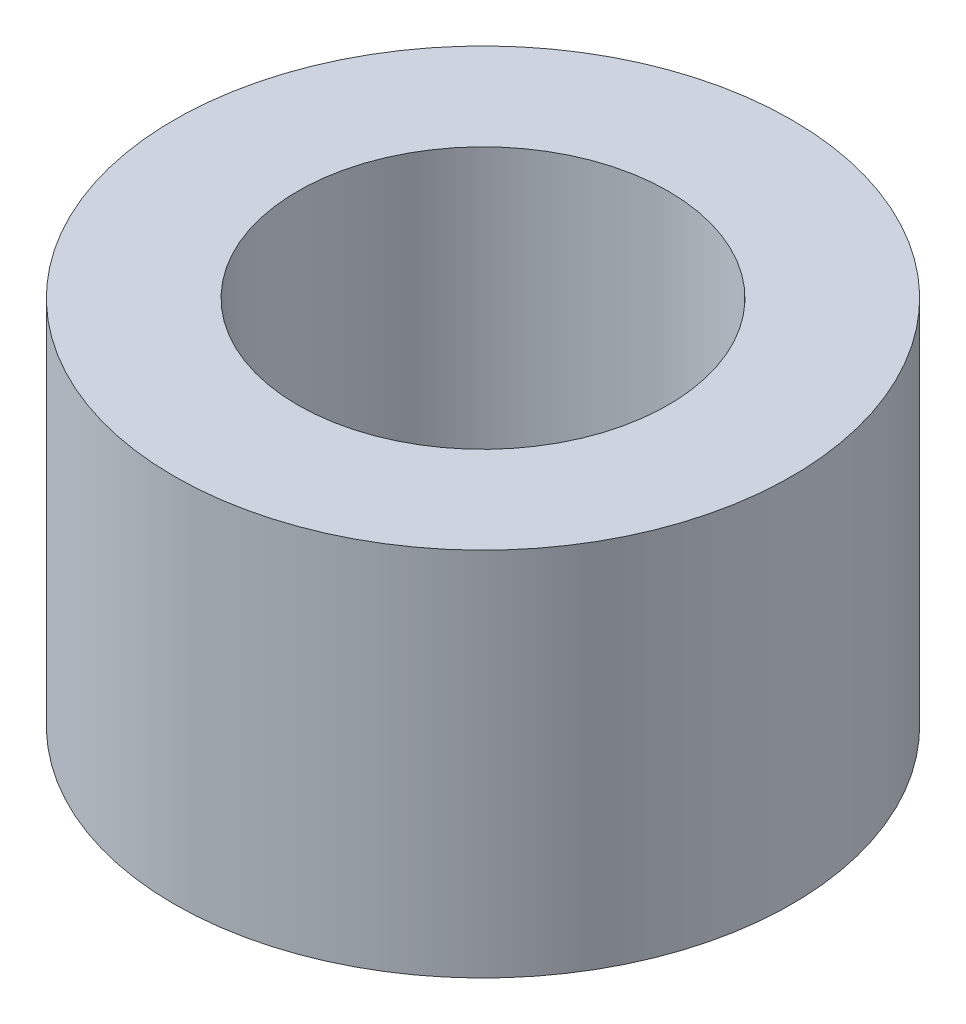
ISO-10303-21;
HEADER;
FILE_DESCRIPTION(('STEP AP214'),'2;1');
FILE_NAME('part.step','',(''),(''),'','','');
FILE_SCHEMA(('AUTOMOTIVE_DESIGN { 1 0 10303 214 1 1 1 1 }'));
ENDSEC;
DATA;
#1=APPLICATION_CONTEXT('core data for automotive mechanical design processes');
#2=APPLICATION_PROTOCOL_DEFINITION('international standard','automotive_design',2000,#1);
#3=PRODUCT_CONTEXT('',#1,'mechanical');
#4=PRODUCT('Part','Part','',(#3));
#5=PRODUCT_RELATED_PRODUCT_CATEGORY('part','',(#4));
#6=PRODUCT_DEFINITION_FORMATION('','',#4);
#7=PRODUCT_DEFINITION_CONTEXT('part definition',#1,'design');
#8=PRODUCT_DEFINITION('design','',#6,#7);
#9=PRODUCT_DEFINITION_SHAPE('','',#8);
#10=(LENGTH_UNIT() NAMED_UNIT(*) SI_UNIT(.MILLI.,.METRE.));
#11=(NAMED_UNIT(*) PLANE_ANGLE_UNIT() SI_UNIT($,.RADIAN.));
#12=(NAMED_UNIT(*) SI_UNIT($,.STERADIAN.) SOLID_ANGLE_UNIT());
#13=UNCERTAINTY_MEASURE_WITH_UNIT(LENGTH_MEASURE(1.E-05),#10,'distance_accuracy_value','');
#14=(GEOMETRIC_REPRESENTATION_CONTEXT(3) GLOBAL_UNCERTAINTY_ASSIGNED_CONTEXT((#13)) GLOBAL_UNIT_ASSIGNED_CONTEXT((#10,
#11,#12)) REPRESENTATION_CONTEXT('',''));
#15=CARTESIAN_POINT('',(0.,0.,0.));
#16=DIRECTION('',(0.,0.,1.));
#17=DIRECTION('',(1.,0.,0.));
#18=AXIS2_PLACEMENT_3D('',#15,#16,#17);
#19=CARTESIAN_POINT('',(0.,3.,0.));
#20=DIRECTION('',(0.,1.,0.));
#21=DIRECTION('',(0.,0.,1.));
#22=AXIS2_PLACEMENT_3D('',#19,#20,#21);
#23=PLANE('',#22);
#24=CARTESIAN_POINT('',(0.,3.,0.));
#25=DIRECTION('',(0.,1.,0.));
#26=DIRECTION('',(0.,0.,1.));
#27=AXIS2_PLACEMENT_3D('',#24,#25,#26);
#28=CIRCLE('',#27,2.5);
#29=CARTESIAN_POINT('',(0.,3.,2.5));
#30=VERTEX_POINT('',#29);
#31=EDGE_CURVE('E10',#30,#30,#28,.T.);
#32=ORIENTED_EDGE('',*,*,#31,.T.);
#33=EDGE_LOOP('',(#32));
#34=FACE_BOUND('',#33,.T.);
#35=CARTESIAN_POINT('',(0.,3.,0.));
#36=DIRECTION('',(0.,1.,0.));
#37=DIRECTION('',(0.,0.,1.));
#38=AXIS2_PLACEMENT_3D('',#35,#36,#37);
#39=CIRCLE('',#38,1.5);
#40=CARTESIAN_POINT('',(0.,3.,1.5));
#41=VERTEX_POINT('',#40);
#42=EDGE_CURVE('E44',#41,#41,#39,.T.);
#43=ORIENTED_EDGE('',*,*,#42,.F.);
#44=EDGE_LOOP('',(#43));
#45=FACE_BOUND('',#44,.T.);
#46=ADVANCED_FACE('F33',(#34,#45),#23,.T.);
#47=CARTESIAN_POINT('',(0.,0.,0.));
#48=DIRECTION('',(0.,1.,0.));
#49=DIRECTION('',(0.,0.,1.));
#50=AXIS2_PLACEMENT_3D('',#47,#48,#49);
#51=PLANE('',#50);
#52=CARTESIAN_POINT('',(0.,0.,0.));
#53=DIRECTION('',(0.,1.,0.));
#54=DIRECTION('',(0.,0.,1.));
#55=AXIS2_PLACEMENT_3D('',#52,#53,#54);
#56=CIRCLE('',#55,2.5);
#57=CARTESIAN_POINT('',(0.,0.,2.5));
#58=VERTEX_POINT('',#57);
#59=EDGE_CURVE('E37',#58,#58,#56,.T.);
#60=ORIENTED_EDGE('',*,*,#59,.F.);
#61=EDGE_LOOP('',(#60));
#62=FACE_BOUND('',#61,.T.);
#63=CARTESIAN_POINT('',(0.,0.,0.));
#64=DIRECTION('',(0.,1.,0.));
#65=DIRECTION('',(0.,0.,1.));
#66=AXIS2_PLACEMENT_3D('',#63,#64,#65);
#67=CIRCLE('',#66,1.5);
#68=CARTESIAN_POINT('',(0.,0.,1.5));
#69=VERTEX_POINT('',#68);
#70=EDGE_CURVE('E46',#69,#69,#67,.T.);
#71=ORIENTED_EDGE('',*,*,#70,.T.);
#72=EDGE_LOOP('',(#71));
#73=FACE_BOUND('',#72,.T.);
#74=ADVANCED_FACE('F56',(#62,#73),#51,.F.);
#75=CARTESIAN_POINT('',(0.,3.,0.));
#76=DIRECTION('',(0.,-1.,0.));
#77=DIRECTION('',(0.,0.,-1.));
#78=AXIS2_PLACEMENT_3D('',#75,#76,#77);
#79=CYLINDRICAL_SURFACE('',#78,2.5);
#80=ORIENTED_EDGE('',*,*,#31,.F.);
#81=EDGE_LOOP('',(#80));
#82=FACE_BOUND('',#81,.T.);
#83=ORIENTED_EDGE('',*,*,#59,.T.);
#84=EDGE_LOOP('',(#83));
#85=FACE_BOUND('',#84,.T.);
#86=ADVANCED_FACE('F35',(#82,#85),#79,.T.);
#87=CARTESIAN_POINT('',(0.,3.,0.));
#88=DIRECTION('',(0.,-1.,0.));
#89=DIRECTION('',(0.,0.,-1.));
#90=AXIS2_PLACEMENT_3D('',#87,#88,#89);
#91=CYLINDRICAL_SURFACE('',#90,1.5);
#92=ORIENTED_EDGE('',*,*,#42,.T.);
#93=EDGE_LOOP('',(#92));
#94=FACE_BOUND('',#93,.T.);
#95=ORIENTED_EDGE('',*,*,#70,.F.);
#96=EDGE_LOOP('',(#95));
#97=FACE_BOUND('',#96,.T.);
#98=ADVANCED_FACE('F52',(#94,#97),#91,.F.);
#99=CLOSED_SHELL('',(#46,#74,#86,#98));
#100=MANIFOLD_SOLID_BREP('B2',#99);
#101=ADVANCED_BREP_SHAPE_REPRESENTATION('',(#18,#100),#14);
#102=SHAPE_DEFINITION_REPRESENTATION(#9,#101);
ENDSEC;
END-ISO-10303-21;
